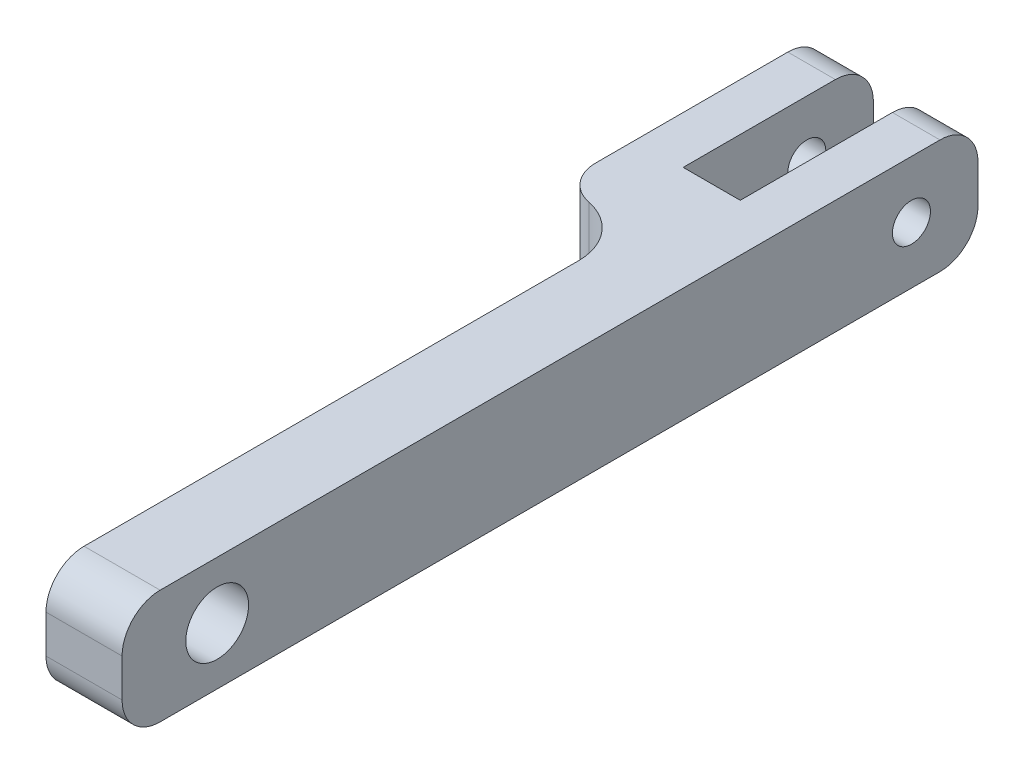
ISO-10303-21;
HEADER;
FILE_DESCRIPTION(('STEP AP214'),'2;1');
FILE_NAME('part.step','',(''),(''),'','','');
FILE_SCHEMA(('AUTOMOTIVE_DESIGN { 1 0 10303 214 1 1 1 1 }'));
ENDSEC;
DATA;
#1=APPLICATION_CONTEXT('core data for automotive mechanical design processes');
#2=APPLICATION_PROTOCOL_DEFINITION('international standard','automotive_design',2000,#1);
#3=PRODUCT_CONTEXT('',#1,'mechanical');
#4=PRODUCT('Part','Part','',(#3));
#5=PRODUCT_RELATED_PRODUCT_CATEGORY('part','',(#4));
#6=PRODUCT_DEFINITION_FORMATION('','',#4);
#7=PRODUCT_DEFINITION_CONTEXT('part definition',#1,'design');
#8=PRODUCT_DEFINITION('design','',#6,#7);
#9=PRODUCT_DEFINITION_SHAPE('','',#8);
#10=(LENGTH_UNIT() NAMED_UNIT(*) SI_UNIT(.MILLI.,.METRE.));
#11=(NAMED_UNIT(*) PLANE_ANGLE_UNIT() SI_UNIT($,.RADIAN.));
#12=(NAMED_UNIT(*) SI_UNIT($,.STERADIAN.) SOLID_ANGLE_UNIT());
#13=UNCERTAINTY_MEASURE_WITH_UNIT(LENGTH_MEASURE(1.E-05),#10,'distance_accuracy_value','');
#14=(GEOMETRIC_REPRESENTATION_CONTEXT(3) GLOBAL_UNCERTAINTY_ASSIGNED_CONTEXT((#13)) GLOBAL_UNIT_ASSIGNED_CONTEXT((#10,
#11,#12)) REPRESENTATION_CONTEXT('',''));
#15=CARTESIAN_POINT('',(0.,0.,0.));
#16=DIRECTION('',(0.,0.,1.));
#17=DIRECTION('',(1.,0.,0.));
#18=AXIS2_PLACEMENT_3D('',#15,#16,#17);
#19=CARTESIAN_POINT('',(4.,0.,-45.));
#20=DIRECTION('',(0.,0.,1.));
#21=DIRECTION('',(1.,0.,0.));
#22=AXIS2_PLACEMENT_3D('',#19,#20,#21);
#23=PLANE('',#22);
#24=DIRECTION('',(0.,-1.,0.));
#25=VECTOR('',#24,1.);
#26=CARTESIAN_POINT('',(1.5,-6.,-45.));
#27=LINE('',#26,#25);
#28=CARTESIAN_POINT('',(1.5,-2.,-45.));
#29=VERTEX_POINT('',#28);
#30=CARTESIAN_POINT('',(1.5,-4.,-45.));
#31=VERTEX_POINT('',#30);
#32=EDGE_CURVE('E180',#29,#31,#27,.T.);
#33=ORIENTED_EDGE('',*,*,#32,.F.);
#34=DIRECTION('',(-1.,0.,0.));
#35=VECTOR('',#34,1.);
#36=CARTESIAN_POINT('',(4.,-2.,-45.));
#37=LINE('',#36,#35);
#38=CARTESIAN_POINT('',(4.,-2.,-45.));
#39=VERTEX_POINT('',#38);
#40=EDGE_CURVE('E257',#29,#39,#37,.F.);
#41=ORIENTED_EDGE('',*,*,#40,.T.);
#42=DIRECTION('',(0.,1.,0.));
#43=VECTOR('',#42,1.);
#44=CARTESIAN_POINT('',(4.,0.,-45.));
#45=LINE('',#44,#43);
#46=CARTESIAN_POINT('',(4.,-4.,-45.));
#47=VERTEX_POINT('',#46);
#48=EDGE_CURVE('E212',#47,#39,#45,.T.);
#49=ORIENTED_EDGE('',*,*,#48,.F.);
#50=DIRECTION('',(-1.,0.,0.));
#51=VECTOR('',#50,1.);
#52=CARTESIAN_POINT('',(4.,-4.,-45.));
#53=LINE('',#52,#51);
#54=EDGE_CURVE('E254',#47,#31,#53,.T.);
#55=ORIENTED_EDGE('',*,*,#54,.T.);
#56=EDGE_LOOP('',(#33,#41,#49,#55));
#57=FACE_BOUND('',#56,.T.);
#58=ADVANCED_FACE('F32',(#57),#23,.F.);
#59=CARTESIAN_POINT('',(0.,0.,0.));
#60=DIRECTION('',(1.,0.,0.));
#61=DIRECTION('',(0.,0.,-1.));
#62=AXIS2_PLACEMENT_3D('',#59,#60,#61);
#63=PLANE('',#62);
#64=CARTESIAN_POINT('',(0.,-3.,-5.));
#65=DIRECTION('',(1.,0.,0.));
#66=DIRECTION('',(0.,0.,-1.));
#67=AXIS2_PLACEMENT_3D('',#64,#65,#66);
#68=CIRCLE('',#67,1.65);
#69=CARTESIAN_POINT('',(0.,-3.,-6.65));
#70=VERTEX_POINT('',#69);
#71=EDGE_CURVE('E199',#70,#70,#68,.T.);
#72=ORIENTED_EDGE('',*,*,#71,.T.);
#73=EDGE_LOOP('',(#72));
#74=FACE_BOUND('',#73,.T.);
#75=DIRECTION('',(0.,0.,1.));
#76=VECTOR('',#75,1.);
#77=CARTESIAN_POINT('',(0.,0.,0.));
#78=LINE('',#77,#76);
#79=CARTESIAN_POINT('',(0.,0.,-28.));
#80=VERTEX_POINT('',#79);
#81=CARTESIAN_POINT('',(0.,0.,-2.));
#82=VERTEX_POINT('',#81);
#83=EDGE_CURVE('E209',#80,#82,#78,.T.);
#84=ORIENTED_EDGE('',*,*,#83,.F.);
#85=DIRECTION('',(0.,1.,0.));
#86=VECTOR('',#85,1.);
#87=CARTESIAN_POINT('',(0.,-6.,-28.));
#88=LINE('',#87,#86);
#89=CARTESIAN_POINT('',(0.,-6.,-28.));
#90=VERTEX_POINT('',#89);
#91=EDGE_CURVE('E264',#80,#90,#88,.F.);
#92=ORIENTED_EDGE('',*,*,#91,.T.);
#93=DIRECTION('',(0.,0.,-1.));
#94=VECTOR('',#93,1.);
#95=CARTESIAN_POINT('',(0.,-6.,0.));
#96=LINE('',#95,#94);
#97=CARTESIAN_POINT('',(0.,-6.,-2.));
#98=VERTEX_POINT('',#97);
#99=EDGE_CURVE('E221',#98,#90,#96,.T.);
#100=ORIENTED_EDGE('',*,*,#99,.F.);
#101=CARTESIAN_POINT('',(0.,-4.,-2.));
#102=DIRECTION('',(1.,0.,0.));
#103=DIRECTION('',(0.,0.,-1.));
#104=AXIS2_PLACEMENT_3D('',#101,#102,#103);
#105=CIRCLE('',#104,2.);
#106=CARTESIAN_POINT('',(0.,-4.,0.));
#107=VERTEX_POINT('',#106);
#108=EDGE_CURVE('E233',#98,#107,#105,.F.);
#109=ORIENTED_EDGE('',*,*,#108,.T.);
#110=DIRECTION('',(0.,-1.,0.));
#111=VECTOR('',#110,1.);
#112=CARTESIAN_POINT('',(0.,0.,0.));
#113=LINE('',#112,#111);
#114=CARTESIAN_POINT('',(0.,-2.,0.));
#115=VERTEX_POINT('',#114);
#116=EDGE_CURVE('E202',#115,#107,#113,.T.);
#117=ORIENTED_EDGE('',*,*,#116,.F.);
#118=CARTESIAN_POINT('',(0.,-2.,-2.));
#119=DIRECTION('',(1.,0.,0.));
#120=DIRECTION('',(0.,0.,-1.));
#121=AXIS2_PLACEMENT_3D('',#118,#119,#120);
#122=CIRCLE('',#121,2.);
#123=EDGE_CURVE('E235',#115,#82,#122,.F.);
#124=ORIENTED_EDGE('',*,*,#123,.T.);
#125=EDGE_LOOP('',(#84,#92,#100,#109,#117,#124));
#126=FACE_BOUND('',#125,.T.);
#127=ADVANCED_FACE('F322',(#74,#126),#63,.F.);
#128=CARTESIAN_POINT('',(4.,0.,0.));
#129=DIRECTION('',(0.,0.,-1.));
#130=DIRECTION('',(0.,1.,0.));
#131=AXIS2_PLACEMENT_3D('',#128,#129,#130);
#132=PLANE('',#131);
#133=DIRECTION('',(0.,-1.,0.));
#134=VECTOR('',#133,1.);
#135=CARTESIAN_POINT('',(4.,0.,0.));
#136=LINE('',#135,#134);
#137=CARTESIAN_POINT('',(4.,-2.,0.));
#138=VERTEX_POINT('',#137);
#139=CARTESIAN_POINT('',(4.,-4.,0.));
#140=VERTEX_POINT('',#139);
#141=EDGE_CURVE('E205',#138,#140,#136,.T.);
#142=ORIENTED_EDGE('',*,*,#141,.F.);
#143=DIRECTION('',(-1.,0.,0.));
#144=VECTOR('',#143,1.);
#145=CARTESIAN_POINT('',(4.,-2.,0.));
#146=LINE('',#145,#144);
#147=EDGE_CURVE('E230',#138,#115,#146,.T.);
#148=ORIENTED_EDGE('',*,*,#147,.T.);
#149=ORIENTED_EDGE('',*,*,#116,.T.);
#150=DIRECTION('',(-1.,0.,0.));
#151=VECTOR('',#150,1.);
#152=CARTESIAN_POINT('',(4.,-4.,0.));
#153=LINE('',#152,#151);
#154=EDGE_CURVE('E218',#107,#140,#153,.F.);
#155=ORIENTED_EDGE('',*,*,#154,.T.);
#156=EDGE_LOOP('',(#142,#148,#149,#155));
#157=FACE_BOUND('',#156,.T.);
#158=ADVANCED_FACE('F332',(#157),#132,.F.);
#159=CARTESIAN_POINT('',(4.,-6.,0.));
#160=DIRECTION('',(0.,1.,0.));
#161=DIRECTION('',(0.,0.,1.));
#162=AXIS2_PLACEMENT_3D('',#159,#160,#161);
#163=PLANE('',#162);
#164=DIRECTION('',(0.,0.,1.));
#165=VECTOR('',#164,1.);
#166=CARTESIAN_POINT('',(-4.,-6.,-45.));
#167=LINE('',#166,#165);
#168=CARTESIAN_POINT('',(-4.,-6.,-43.));
#169=VERTEX_POINT('',#168);
#170=CARTESIAN_POINT('',(-4.,-6.,-32.8989794855664));
#171=VERTEX_POINT('',#170);
#172=EDGE_CURVE('E193',#169,#171,#167,.T.);
#173=ORIENTED_EDGE('',*,*,#172,.F.);
#174=DIRECTION('',(-1.,0.,0.));
#175=VECTOR('',#174,1.);
#176=CARTESIAN_POINT('',(4.,-6.,-43.));
#177=LINE('',#176,#175);
#178=CARTESIAN_POINT('',(-1.5,-6.,-43.));
#179=VERTEX_POINT('',#178);
#180=EDGE_CURVE('E11',#169,#179,#177,.F.);
#181=ORIENTED_EDGE('',*,*,#180,.T.);
#182=DIRECTION('',(0.,0.,-1.));
#183=VECTOR('',#182,1.);
#184=CARTESIAN_POINT('',(-1.5,-6.,-35.));
#185=LINE('',#184,#183);
#186=CARTESIAN_POINT('',(-1.5,-6.,-35.));
#187=VERTEX_POINT('',#186);
#188=EDGE_CURVE('E162',#187,#179,#185,.T.);
#189=ORIENTED_EDGE('',*,*,#188,.F.);
#190=DIRECTION('',(-1.,0.,0.));
#191=VECTOR('',#190,1.);
#192=CARTESIAN_POINT('',(1.5,-6.,-35.));
#193=LINE('',#192,#191);
#194=CARTESIAN_POINT('',(1.5,-6.,-35.));
#195=VERTEX_POINT('',#194);
#196=EDGE_CURVE('E168',#195,#187,#193,.T.);
#197=ORIENTED_EDGE('',*,*,#196,.F.);
#198=DIRECTION('',(0.,0.,-1.));
#199=VECTOR('',#198,1.);
#200=CARTESIAN_POINT('',(1.5,-6.,-35.));
#201=LINE('',#200,#199);
#202=CARTESIAN_POINT('',(1.5,-6.,-43.));
#203=VERTEX_POINT('',#202);
#204=EDGE_CURVE('E152',#195,#203,#201,.T.);
#205=ORIENTED_EDGE('',*,*,#204,.T.);
#206=DIRECTION('',(-1.,0.,0.));
#207=VECTOR('',#206,1.);
#208=CARTESIAN_POINT('',(4.,-6.,-43.));
#209=LINE('',#208,#207);
#210=CARTESIAN_POINT('',(4.,-6.,-43.));
#211=VERTEX_POINT('',#210);
#212=EDGE_CURVE('E262',#203,#211,#209,.F.);
#213=ORIENTED_EDGE('',*,*,#212,.T.);
#214=DIRECTION('',(0.,0.,-1.));
#215=VECTOR('',#214,1.);
#216=CARTESIAN_POINT('',(4.,-6.,0.));
#217=LINE('',#216,#215);
#218=CARTESIAN_POINT('',(4.,-6.,-2.));
#219=VERTEX_POINT('',#218);
#220=EDGE_CURVE('E208',#219,#211,#217,.T.);
#221=ORIENTED_EDGE('',*,*,#220,.F.);
#222=DIRECTION('',(-1.,0.,0.));
#223=VECTOR('',#222,1.);
#224=CARTESIAN_POINT('',(4.,-6.,-2.));
#225=LINE('',#224,#223);
#226=EDGE_CURVE('E259',#219,#98,#225,.T.);
#227=ORIENTED_EDGE('',*,*,#226,.T.);
#228=ORIENTED_EDGE('',*,*,#99,.T.);
#229=CARTESIAN_POINT('',(-3.,-6.,-28.));
#230=DIRECTION('',(0.,1.,0.));
#231=DIRECTION('',(0.,0.,1.));
#232=AXIS2_PLACEMENT_3D('',#229,#230,#231);
#233=CIRCLE('',#232,3.);
#234=CARTESIAN_POINT('',(-2.4,-6.,-30.9393876913398));
#235=VERTEX_POINT('',#234);
#236=EDGE_CURVE('E268',#90,#235,#233,.T.);
#237=ORIENTED_EDGE('',*,*,#236,.T.);
#238=CARTESIAN_POINT('',(-2.,-6.,-32.8989794855664));
#239=DIRECTION('',(0.,1.,0.));
#240=DIRECTION('',(0.,0.,1.));
#241=AXIS2_PLACEMENT_3D('',#238,#239,#240);
#242=CIRCLE('',#241,2.);
#243=EDGE_CURVE('E278',#235,#171,#242,.F.);
#244=ORIENTED_EDGE('',*,*,#243,.T.);
#245=EDGE_LOOP('',(#173,#181,#189,#197,#205,#213,#221,#227,#228,#237,#244));
#246=FACE_BOUND('',#245,.T.);
#247=ADVANCED_FACE('F173',(#246),#163,.F.);
#248=DIRECTION('',(0.,-1.,0.));
#249=VECTOR('',#248,1.);
#250=CARTESIAN_POINT('',(-4.,-6.,-45.));
#251=LINE('',#250,#249);
#252=CARTESIAN_POINT('',(-4.,-2.,-45.));
#253=VERTEX_POINT('',#252);
#254=CARTESIAN_POINT('',(-4.,-4.,-45.));
#255=VERTEX_POINT('',#254);
#256=EDGE_CURVE('E186',#253,#255,#251,.T.);
#257=ORIENTED_EDGE('',*,*,#256,.F.);
#258=DIRECTION('',(-1.,0.,0.));
#259=VECTOR('',#258,1.);
#260=CARTESIAN_POINT('',(4.,-2.,-45.));
#261=LINE('',#260,#259);
#262=CARTESIAN_POINT('',(-1.5,-2.,-45.));
#263=VERTEX_POINT('',#262);
#264=EDGE_CURVE('E53',#253,#263,#261,.F.);
#265=ORIENTED_EDGE('',*,*,#264,.T.);
#266=DIRECTION('',(0.,1.,0.));
#267=VECTOR('',#266,1.);
#268=CARTESIAN_POINT('',(-1.5,-6.,-45.));
#269=LINE('',#268,#267);
#270=CARTESIAN_POINT('',(-1.5,-4.,-45.));
#271=VERTEX_POINT('',#270);
#272=EDGE_CURVE('E171',#271,#263,#269,.T.);
#273=ORIENTED_EDGE('',*,*,#272,.F.);
#274=DIRECTION('',(-1.,0.,0.));
#275=VECTOR('',#274,1.);
#276=CARTESIAN_POINT('',(4.,-4.,-45.));
#277=LINE('',#276,#275);
#278=EDGE_CURVE('E288',#271,#255,#277,.T.);
#279=ORIENTED_EDGE('',*,*,#278,.T.);
#280=EDGE_LOOP('',(#257,#265,#273,#279));
#281=FACE_BOUND('',#280,.T.);
#282=ADVANCED_FACE('F305',(#281),#23,.F.);
#283=CARTESIAN_POINT('',(4.,0.,0.));
#284=DIRECTION('',(0.,-1.,0.));
#285=DIRECTION('',(0.,0.,-1.));
#286=AXIS2_PLACEMENT_3D('',#283,#284,#285);
#287=PLANE('',#286);
#288=DIRECTION('',(0.,0.,-1.));
#289=VECTOR('',#288,1.);
#290=CARTESIAN_POINT('',(-1.5,0.,-35.));
#291=LINE('',#290,#289);
#292=CARTESIAN_POINT('',(-1.5,0.,-35.));
#293=VERTEX_POINT('',#292);
#294=CARTESIAN_POINT('',(-1.5,0.,-43.));
#295=VERTEX_POINT('',#294);
#296=EDGE_CURVE('E187',#293,#295,#291,.T.);
#297=ORIENTED_EDGE('',*,*,#296,.T.);
#298=DIRECTION('',(-1.,0.,0.));
#299=VECTOR('',#298,1.);
#300=CARTESIAN_POINT('',(4.,0.,-43.));
#301=LINE('',#300,#299);
#302=CARTESIAN_POINT('',(-4.,0.,-43.));
#303=VERTEX_POINT('',#302);
#304=EDGE_CURVE('E281',#295,#303,#301,.T.);
#305=ORIENTED_EDGE('',*,*,#304,.T.);
#306=DIRECTION('',(0.,0.,-1.));
#307=VECTOR('',#306,1.);
#308=CARTESIAN_POINT('',(-4.,0.,-45.));
#309=LINE('',#308,#307);
#310=CARTESIAN_POINT('',(-4.,0.,-32.8989794855664));
#311=VERTEX_POINT('',#310);
#312=EDGE_CURVE('E195',#311,#303,#309,.T.);
#313=ORIENTED_EDGE('',*,*,#312,.F.);
#314=CARTESIAN_POINT('',(-2.,0.,-32.8989794855664));
#315=DIRECTION('',(0.,-1.,0.));
#316=DIRECTION('',(0.,0.,-1.));
#317=AXIS2_PLACEMENT_3D('',#314,#315,#316);
#318=CIRCLE('',#317,2.);
#319=CARTESIAN_POINT('',(-2.4,0.,-30.9393876913398));
#320=VERTEX_POINT('',#319);
#321=EDGE_CURVE('E274',#311,#320,#318,.F.);
#322=ORIENTED_EDGE('',*,*,#321,.T.);
#323=CARTESIAN_POINT('',(-3.,0.,-28.));
#324=DIRECTION('',(0.,-1.,0.));
#325=DIRECTION('',(0.,0.,-1.));
#326=AXIS2_PLACEMENT_3D('',#323,#324,#325);
#327=CIRCLE('',#326,3.);
#328=EDGE_CURVE('E266',#320,#80,#327,.T.);
#329=ORIENTED_EDGE('',*,*,#328,.T.);
#330=ORIENTED_EDGE('',*,*,#83,.T.);
#331=DIRECTION('',(-1.,0.,0.));
#332=VECTOR('',#331,1.);
#333=CARTESIAN_POINT('',(4.,0.,-2.));
#334=LINE('',#333,#332);
#335=CARTESIAN_POINT('',(4.,0.,-2.));
#336=VERTEX_POINT('',#335);
#337=EDGE_CURVE('E241',#82,#336,#334,.F.);
#338=ORIENTED_EDGE('',*,*,#337,.T.);
#339=DIRECTION('',(0.,0.,1.));
#340=VECTOR('',#339,1.);
#341=CARTESIAN_POINT('',(4.,0.,0.));
#342=LINE('',#341,#340);
#343=CARTESIAN_POINT('',(4.,0.,-43.));
#344=VERTEX_POINT('',#343);
#345=EDGE_CURVE('E215',#344,#336,#342,.T.);
#346=ORIENTED_EDGE('',*,*,#345,.F.);
#347=DIRECTION('',(-1.,0.,0.));
#348=VECTOR('',#347,1.);
#349=CARTESIAN_POINT('',(4.,0.,-43.));
#350=LINE('',#349,#348);
#351=CARTESIAN_POINT('',(1.5,0.,-43.));
#352=VERTEX_POINT('',#351);
#353=EDGE_CURVE('E238',#344,#352,#350,.T.);
#354=ORIENTED_EDGE('',*,*,#353,.T.);
#355=DIRECTION('',(0.,0.,-1.));
#356=VECTOR('',#355,1.);
#357=CARTESIAN_POINT('',(1.5,0.,-35.));
#358=LINE('',#357,#356);
#359=CARTESIAN_POINT('',(1.5,0.,-35.));
#360=VERTEX_POINT('',#359);
#361=EDGE_CURVE('E184',#360,#352,#358,.T.);
#362=ORIENTED_EDGE('',*,*,#361,.F.);
#363=DIRECTION('',(1.,0.,0.));
#364=VECTOR('',#363,1.);
#365=CARTESIAN_POINT('',(1.5,0.,-35.));
#366=LINE('',#365,#364);
#367=EDGE_CURVE('E163',#293,#360,#366,.T.);
#368=ORIENTED_EDGE('',*,*,#367,.F.);
#369=EDGE_LOOP('',(#297,#305,#313,#322,#329,#330,#338,#346,#354,#362,#368));
#370=FACE_BOUND('',#369,.T.);
#371=ADVANCED_FACE('F300',(#370),#287,.F.);
#372=CARTESIAN_POINT('',(4.,0.,0.));
#373=DIRECTION('',(1.,0.,0.));
#374=DIRECTION('',(0.,0.,-1.));
#375=AXIS2_PLACEMENT_3D('',#372,#373,#374);
#376=PLANE('',#375);
#377=CARTESIAN_POINT('',(4.,-3.,-41.5));
#378=DIRECTION('',(-1.,0.,0.));
#379=DIRECTION('',(0.,0.,1.));
#380=AXIS2_PLACEMENT_3D('',#377,#378,#379);
#381=CIRCLE('',#380,0.999999999999998);
#382=CARTESIAN_POINT('',(4.,-3.,-40.5));
#383=VERTEX_POINT('',#382);
#384=EDGE_CURVE('E228',#383,#383,#381,.T.);
#385=ORIENTED_EDGE('',*,*,#384,.T.);
#386=EDGE_LOOP('',(#385));
#387=FACE_BOUND('',#386,.T.);
#388=CARTESIAN_POINT('',(4.,-3.,-5.));
#389=DIRECTION('',(1.,0.,0.));
#390=DIRECTION('',(0.,0.,-1.));
#391=AXIS2_PLACEMENT_3D('',#388,#389,#390);
#392=CIRCLE('',#391,1.65);
#393=CARTESIAN_POINT('',(4.,-3.,-6.65));
#394=VERTEX_POINT('',#393);
#395=EDGE_CURVE('E198',#394,#394,#392,.T.);
#396=ORIENTED_EDGE('',*,*,#395,.F.);
#397=EDGE_LOOP('',(#396));
#398=FACE_BOUND('',#397,.T.);
#399=ORIENTED_EDGE('',*,*,#345,.T.);
#400=CARTESIAN_POINT('',(4.,-2.,-2.));
#401=DIRECTION('',(1.,0.,0.));
#402=DIRECTION('',(0.,0.,-1.));
#403=AXIS2_PLACEMENT_3D('',#400,#401,#402);
#404=CIRCLE('',#403,2.);
#405=EDGE_CURVE('E249',#336,#138,#404,.T.);
#406=ORIENTED_EDGE('',*,*,#405,.T.);
#407=ORIENTED_EDGE('',*,*,#141,.T.);
#408=CARTESIAN_POINT('',(4.,-4.,-2.));
#409=DIRECTION('',(1.,0.,0.));
#410=DIRECTION('',(0.,0.,-1.));
#411=AXIS2_PLACEMENT_3D('',#408,#409,#410);
#412=CIRCLE('',#411,2.);
#413=EDGE_CURVE('E243',#140,#219,#412,.T.);
#414=ORIENTED_EDGE('',*,*,#413,.T.);
#415=ORIENTED_EDGE('',*,*,#220,.T.);
#416=CARTESIAN_POINT('',(4.,-4.,-43.));
#417=DIRECTION('',(1.,0.,0.));
#418=DIRECTION('',(0.,0.,-1.));
#419=AXIS2_PLACEMENT_3D('',#416,#417,#418);
#420=CIRCLE('',#419,2.);
#421=EDGE_CURVE('E245',#211,#47,#420,.T.);
#422=ORIENTED_EDGE('',*,*,#421,.T.);
#423=ORIENTED_EDGE('',*,*,#48,.T.);
#424=CARTESIAN_POINT('',(4.,-2.,-43.));
#425=DIRECTION('',(1.,0.,0.));
#426=DIRECTION('',(0.,0.,-1.));
#427=AXIS2_PLACEMENT_3D('',#424,#425,#426);
#428=CIRCLE('',#427,2.);
#429=EDGE_CURVE('E247',#39,#344,#428,.T.);
#430=ORIENTED_EDGE('',*,*,#429,.T.);
#431=EDGE_LOOP('',(#399,#406,#407,#414,#415,#422,#423,#430));
#432=FACE_BOUND('',#431,.T.);
#433=ADVANCED_FACE('F341',(#387,#398,#432),#376,.T.);
#434=CARTESIAN_POINT('',(0.,-3.,-5.));
#435=DIRECTION('',(1.,0.,0.));
#436=DIRECTION('',(0.,0.,-1.));
#437=AXIS2_PLACEMENT_3D('',#434,#435,#436);
#438=CYLINDRICAL_SURFACE('',#437,1.65);
#439=ORIENTED_EDGE('',*,*,#71,.F.);
#440=EDGE_LOOP('',(#439));
#441=FACE_BOUND('',#440,.T.);
#442=ORIENTED_EDGE('',*,*,#395,.T.);
#443=EDGE_LOOP('',(#442));
#444=FACE_BOUND('',#443,.T.);
#445=ADVANCED_FACE('F405',(#441,#444),#438,.F.);
#446=CARTESIAN_POINT('',(-4.,0.,0.));
#447=DIRECTION('',(1.,0.,0.));
#448=DIRECTION('',(0.,0.,-1.));
#449=AXIS2_PLACEMENT_3D('',#446,#447,#448);
#450=PLANE('',#449);
#451=CARTESIAN_POINT('',(-4.,-3.,-41.5));
#452=DIRECTION('',(-1.,0.,0.));
#453=DIRECTION('',(0.,0.,1.));
#454=AXIS2_PLACEMENT_3D('',#451,#452,#453);
#455=CIRCLE('',#454,0.999999999999998);
#456=CARTESIAN_POINT('',(-4.,-3.,-40.5));
#457=VERTEX_POINT('',#456);
#458=EDGE_CURVE('E418',#457,#457,#455,.T.);
#459=ORIENTED_EDGE('',*,*,#458,.F.);
#460=EDGE_LOOP('',(#459));
#461=FACE_BOUND('',#460,.T.);
#462=ORIENTED_EDGE('',*,*,#312,.T.);
#463=CARTESIAN_POINT('',(-4.,-2.,-43.));
#464=DIRECTION('',(1.,0.,0.));
#465=DIRECTION('',(0.,0.,-1.));
#466=AXIS2_PLACEMENT_3D('',#463,#464,#465);
#467=CIRCLE('',#466,2.);
#468=EDGE_CURVE('E286',#303,#253,#467,.F.);
#469=ORIENTED_EDGE('',*,*,#468,.T.);
#470=ORIENTED_EDGE('',*,*,#256,.T.);
#471=CARTESIAN_POINT('',(-4.,-4.,-43.));
#472=DIRECTION('',(1.,0.,0.));
#473=DIRECTION('',(0.,0.,-1.));
#474=AXIS2_PLACEMENT_3D('',#471,#472,#473);
#475=CIRCLE('',#474,2.);
#476=EDGE_CURVE('E284',#255,#169,#475,.F.);
#477=ORIENTED_EDGE('',*,*,#476,.T.);
#478=ORIENTED_EDGE('',*,*,#172,.T.);
#479=DIRECTION('',(0.,-1.,0.));
#480=VECTOR('',#479,1.);
#481=CARTESIAN_POINT('',(-4.,0.,-32.8989794855664));
#482=LINE('',#481,#480);
#483=EDGE_CURVE('E271',#171,#311,#482,.F.);
#484=ORIENTED_EDGE('',*,*,#483,.T.);
#485=EDGE_LOOP('',(#462,#469,#470,#477,#478,#484));
#486=FACE_BOUND('',#485,.T.);
#487=ADVANCED_FACE('F304',(#461,#486),#450,.F.);
#488=CARTESIAN_POINT('',(1.5,-6.,-35.));
#489=DIRECTION('',(1.,0.,0.));
#490=DIRECTION('',(0.,0.,-1.));
#491=AXIS2_PLACEMENT_3D('',#488,#489,#490);
#492=PLANE('',#491);
#493=CARTESIAN_POINT('',(1.5,-3.,-41.5));
#494=DIRECTION('',(1.,0.,0.));
#495=DIRECTION('',(0.,0.,-1.));
#496=AXIS2_PLACEMENT_3D('',#493,#494,#495);
#497=CIRCLE('',#496,0.999999999999998);
#498=CARTESIAN_POINT('',(1.5,-3.,-42.5));
#499=VERTEX_POINT('',#498);
#500=EDGE_CURVE('E182',#499,#499,#497,.T.);
#501=ORIENTED_EDGE('',*,*,#500,.T.);
#502=EDGE_LOOP('',(#501));
#503=FACE_BOUND('',#502,.T.);
#504=ORIENTED_EDGE('',*,*,#361,.T.);
#505=CARTESIAN_POINT('',(1.5,-2.,-43.));
#506=DIRECTION('',(1.,0.,0.));
#507=DIRECTION('',(0.,0.,-1.));
#508=AXIS2_PLACEMENT_3D('',#505,#506,#507);
#509=CIRCLE('',#508,2.);
#510=EDGE_CURVE('E252',#352,#29,#509,.F.);
#511=ORIENTED_EDGE('',*,*,#510,.T.);
#512=ORIENTED_EDGE('',*,*,#32,.T.);
#513=CARTESIAN_POINT('',(1.5,-4.,-43.));
#514=DIRECTION('',(1.,0.,0.));
#515=DIRECTION('',(0.,0.,-1.));
#516=AXIS2_PLACEMENT_3D('',#513,#514,#515);
#517=CIRCLE('',#516,2.);
#518=EDGE_CURVE('E159',#31,#203,#517,.F.);
#519=ORIENTED_EDGE('',*,*,#518,.T.);
#520=ORIENTED_EDGE('',*,*,#204,.F.);
#521=DIRECTION('',(0.,-1.,0.));
#522=VECTOR('',#521,1.);
#523=CARTESIAN_POINT('',(1.5,-6.,-35.));
#524=LINE('',#523,#522);
#525=EDGE_CURVE('E156',#360,#195,#524,.T.);
#526=ORIENTED_EDGE('',*,*,#525,.F.);
#527=EDGE_LOOP('',(#504,#511,#512,#519,#520,#526));
#528=FACE_BOUND('',#527,.T.);
#529=ADVANCED_FACE('F155',(#503,#528),#492,.F.);
#530=CARTESIAN_POINT('',(-1.5,-6.,-35.));
#531=DIRECTION('',(-1.,0.,0.));
#532=DIRECTION('',(0.,-1.,0.));
#533=AXIS2_PLACEMENT_3D('',#530,#531,#532);
#534=PLANE('',#533);
#535=CARTESIAN_POINT('',(-1.5,-3.,-41.5));
#536=DIRECTION('',(-1.,0.,0.));
#537=DIRECTION('',(0.,-1.,0.));
#538=AXIS2_PLACEMENT_3D('',#535,#536,#537);
#539=CIRCLE('',#538,0.999999999999998);
#540=CARTESIAN_POINT('',(-1.5,-4.,-41.5));
#541=VERTEX_POINT('',#540);
#542=EDGE_CURVE('E225',#541,#541,#539,.T.);
#543=ORIENTED_EDGE('',*,*,#542,.T.);
#544=EDGE_LOOP('',(#543));
#545=FACE_BOUND('',#544,.T.);
#546=ORIENTED_EDGE('',*,*,#272,.T.);
#547=CARTESIAN_POINT('',(-1.5,-2.,-43.));
#548=DIRECTION('',(-1.,0.,0.));
#549=DIRECTION('',(0.,-1.,0.));
#550=AXIS2_PLACEMENT_3D('',#547,#548,#549);
#551=CIRCLE('',#550,2.);
#552=EDGE_CURVE('E40',#263,#295,#551,.F.);
#553=ORIENTED_EDGE('',*,*,#552,.T.);
#554=ORIENTED_EDGE('',*,*,#296,.F.);
#555=DIRECTION('',(0.,1.,0.));
#556=VECTOR('',#555,1.);
#557=CARTESIAN_POINT('',(-1.5,-6.,-35.));
#558=LINE('',#557,#556);
#559=EDGE_CURVE('E174',#187,#293,#558,.T.);
#560=ORIENTED_EDGE('',*,*,#559,.F.);
#561=ORIENTED_EDGE('',*,*,#188,.T.);
#562=CARTESIAN_POINT('',(-1.5,-4.,-43.));
#563=DIRECTION('',(-1.,0.,0.));
#564=DIRECTION('',(0.,-1.,0.));
#565=AXIS2_PLACEMENT_3D('',#562,#563,#564);
#566=CIRCLE('',#565,2.);
#567=EDGE_CURVE('E292',#179,#271,#566,.F.);
#568=ORIENTED_EDGE('',*,*,#567,.T.);
#569=EDGE_LOOP('',(#546,#553,#554,#560,#561,#568));
#570=FACE_BOUND('',#569,.T.);
#571=ADVANCED_FACE('F296',(#545,#570),#534,.F.);
#572=CARTESIAN_POINT('',(0.,0.,-35.));
#573=DIRECTION('',(0.,0.,1.));
#574=DIRECTION('',(1.,0.,0.));
#575=AXIS2_PLACEMENT_3D('',#572,#573,#574);
#576=PLANE('',#575);
#577=ORIENTED_EDGE('',*,*,#525,.T.);
#578=ORIENTED_EDGE('',*,*,#196,.T.);
#579=ORIENTED_EDGE('',*,*,#559,.T.);
#580=ORIENTED_EDGE('',*,*,#367,.T.);
#581=EDGE_LOOP('',(#577,#578,#579,#580));
#582=FACE_BOUND('',#581,.T.);
#583=ADVANCED_FACE('F167',(#582),#576,.F.);
#584=CARTESIAN_POINT('',(4.,-3.,-41.5));
#585=DIRECTION('',(-1.,0.,0.));
#586=DIRECTION('',(0.,0.,1.));
#587=AXIS2_PLACEMENT_3D('',#584,#585,#586);
#588=CYLINDRICAL_SURFACE('',#587,0.999999999999998);
#589=ORIENTED_EDGE('',*,*,#458,.T.);
#590=EDGE_LOOP('',(#589));
#591=FACE_BOUND('',#590,.T.);
#592=ORIENTED_EDGE('',*,*,#542,.F.);
#593=EDGE_LOOP('',(#592));
#594=FACE_BOUND('',#593,.T.);
#595=ADVANCED_FACE('F385',(#591,#594),#588,.F.);
#596=ORIENTED_EDGE('',*,*,#384,.F.);
#597=EDGE_LOOP('',(#596));
#598=FACE_BOUND('',#597,.T.);
#599=ORIENTED_EDGE('',*,*,#500,.F.);
#600=EDGE_LOOP('',(#599));
#601=FACE_BOUND('',#600,.T.);
#602=ADVANCED_FACE('F381',(#598,#601),#588,.F.);
#603=CARTESIAN_POINT('',(4.,-2.,-2.));
#604=DIRECTION('',(-1.,0.,0.));
#605=DIRECTION('',(0.,0.,1.));
#606=AXIS2_PLACEMENT_3D('',#603,#604,#605);
#607=CYLINDRICAL_SURFACE('',#606,2.);
#608=ORIENTED_EDGE('',*,*,#405,.F.);
#609=ORIENTED_EDGE('',*,*,#337,.F.);
#610=ORIENTED_EDGE('',*,*,#123,.F.);
#611=ORIENTED_EDGE('',*,*,#147,.F.);
#612=EDGE_LOOP('',(#608,#609,#610,#611));
#613=FACE_BOUND('',#612,.T.);
#614=ADVANCED_FACE('F336',(#613),#607,.T.);
#615=CARTESIAN_POINT('',(4.,-2.,-43.));
#616=DIRECTION('',(-1.,0.,0.));
#617=DIRECTION('',(0.,0.,1.));
#618=AXIS2_PLACEMENT_3D('',#615,#616,#617);
#619=CYLINDRICAL_SURFACE('',#618,2.);
#620=ORIENTED_EDGE('',*,*,#429,.F.);
#621=ORIENTED_EDGE('',*,*,#40,.F.);
#622=ORIENTED_EDGE('',*,*,#510,.F.);
#623=ORIENTED_EDGE('',*,*,#353,.F.);
#624=EDGE_LOOP('',(#620,#621,#622,#623));
#625=FACE_BOUND('',#624,.T.);
#626=ADVANCED_FACE('F346',(#625),#619,.T.);
#627=CARTESIAN_POINT('',(4.,-4.,-43.));
#628=DIRECTION('',(-1.,0.,0.));
#629=DIRECTION('',(0.,0.,1.));
#630=AXIS2_PLACEMENT_3D('',#627,#628,#629);
#631=CYLINDRICAL_SURFACE('',#630,2.);
#632=ORIENTED_EDGE('',*,*,#421,.F.);
#633=ORIENTED_EDGE('',*,*,#212,.F.);
#634=ORIENTED_EDGE('',*,*,#518,.F.);
#635=ORIENTED_EDGE('',*,*,#54,.F.);
#636=EDGE_LOOP('',(#632,#633,#634,#635));
#637=FACE_BOUND('',#636,.T.);
#638=ADVANCED_FACE('F352',(#637),#631,.T.);
#639=CARTESIAN_POINT('',(4.,-4.,-2.));
#640=DIRECTION('',(-1.,0.,0.));
#641=DIRECTION('',(0.,0.,1.));
#642=AXIS2_PLACEMENT_3D('',#639,#640,#641);
#643=CYLINDRICAL_SURFACE('',#642,2.);
#644=ORIENTED_EDGE('',*,*,#413,.F.);
#645=ORIENTED_EDGE('',*,*,#154,.F.);
#646=ORIENTED_EDGE('',*,*,#108,.F.);
#647=ORIENTED_EDGE('',*,*,#226,.F.);
#648=EDGE_LOOP('',(#644,#645,#646,#647));
#649=FACE_BOUND('',#648,.T.);
#650=ADVANCED_FACE('F327',(#649),#643,.T.);
#651=CARTESIAN_POINT('',(-3.,-6.,-28.));
#652=DIRECTION('',(0.,-1.,0.));
#653=DIRECTION('',(0.,0.,-1.));
#654=AXIS2_PLACEMENT_3D('',#651,#652,#653);
#655=CYLINDRICAL_SURFACE('',#654,3.);
#656=ORIENTED_EDGE('',*,*,#328,.F.);
#657=DIRECTION('',(0.,-1.,0.));
#658=VECTOR('',#657,1.);
#659=CARTESIAN_POINT('',(-2.4,-6.,-30.9393876913398));
#660=LINE('',#659,#658);
#661=EDGE_CURVE('E276',#320,#235,#660,.T.);
#662=ORIENTED_EDGE('',*,*,#661,.T.);
#663=ORIENTED_EDGE('',*,*,#236,.F.);
#664=ORIENTED_EDGE('',*,*,#91,.F.);
#665=EDGE_LOOP('',(#656,#662,#663,#664));
#666=FACE_BOUND('',#665,.T.);
#667=ADVANCED_FACE('F319',(#666),#655,.F.);
#668=CARTESIAN_POINT('',(-2.,-6.,-32.8989794855664));
#669=DIRECTION('',(0.,-1.,0.));
#670=DIRECTION('',(0.,0.,-1.));
#671=AXIS2_PLACEMENT_3D('',#668,#669,#670);
#672=CYLINDRICAL_SURFACE('',#671,2.);
#673=ORIENTED_EDGE('',*,*,#243,.F.);
#674=ORIENTED_EDGE('',*,*,#661,.F.);
#675=ORIENTED_EDGE('',*,*,#321,.F.);
#676=ORIENTED_EDGE('',*,*,#483,.F.);
#677=EDGE_LOOP('',(#673,#674,#675,#676));
#678=FACE_BOUND('',#677,.T.);
#679=ADVANCED_FACE('F314',(#678),#672,.T.);
#680=CARTESIAN_POINT('',(4.,-2.,-43.));
#681=DIRECTION('',(-1.,0.,0.));
#682=DIRECTION('',(0.,0.,1.));
#683=AXIS2_PLACEMENT_3D('',#680,#681,#682);
#684=CYLINDRICAL_SURFACE('',#683,2.);
#685=ORIENTED_EDGE('',*,*,#552,.F.);
#686=ORIENTED_EDGE('',*,*,#264,.F.);
#687=ORIENTED_EDGE('',*,*,#468,.F.);
#688=ORIENTED_EDGE('',*,*,#304,.F.);
#689=EDGE_LOOP('',(#685,#686,#687,#688));
#690=FACE_BOUND('',#689,.T.);
#691=ADVANCED_FACE('F302',(#690),#684,.T.);
#692=CARTESIAN_POINT('',(4.,-4.,-43.));
#693=DIRECTION('',(-1.,0.,0.));
#694=DIRECTION('',(0.,0.,1.));
#695=AXIS2_PLACEMENT_3D('',#692,#693,#694);
#696=CYLINDRICAL_SURFACE('',#695,2.);
#697=ORIENTED_EDGE('',*,*,#567,.F.);
#698=ORIENTED_EDGE('',*,*,#180,.F.);
#699=ORIENTED_EDGE('',*,*,#476,.F.);
#700=ORIENTED_EDGE('',*,*,#278,.F.);
#701=EDGE_LOOP('',(#697,#698,#699,#700));
#702=FACE_BOUND('',#701,.T.);
#703=ADVANCED_FACE('F34',(#702),#696,.T.);
#704=CLOSED_SHELL('',(#58,#127,#158,#247,#282,#371,#433,#445,#487,#529,#571,#583,#595,#602,#614,
#626,#638,#650,#667,#679,#691,#703));
#705=MANIFOLD_SOLID_BREP('B2',#704);
#706=ADVANCED_BREP_SHAPE_REPRESENTATION('',(#18,#705),#14);
#707=SHAPE_DEFINITION_REPRESENTATION(#9,#706);
ENDSEC;
END-ISO-10303-21;
